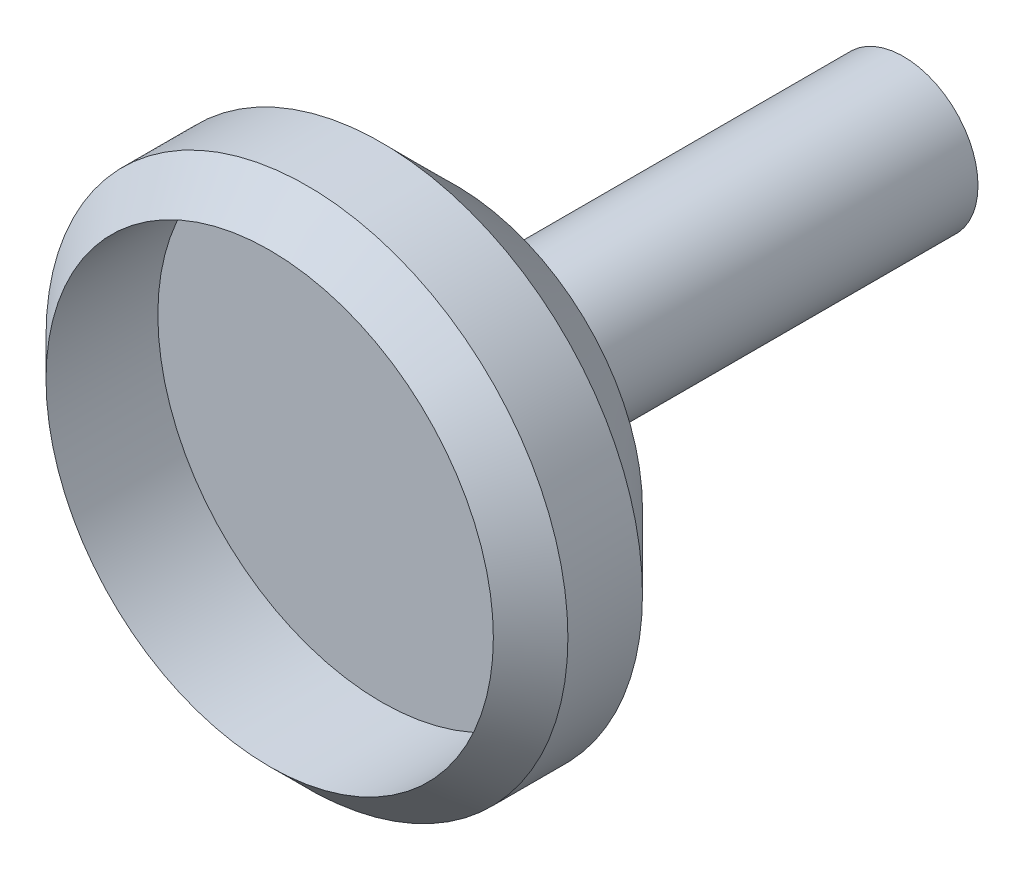
ISO-10303-21;
HEADER;
FILE_DESCRIPTION(('STEP AP214'),'2;1');
FILE_NAME('part.step','',(''),(''),'','','');
FILE_SCHEMA(('AUTOMOTIVE_DESIGN { 1 0 10303 214 1 1 1 1 }'));
ENDSEC;
DATA;
#1=APPLICATION_CONTEXT('core data for automotive mechanical design processes');
#2=APPLICATION_PROTOCOL_DEFINITION('international standard','automotive_design',2000,#1);
#3=PRODUCT_CONTEXT('',#1,'mechanical');
#4=PRODUCT('Part','Part','',(#3));
#5=PRODUCT_RELATED_PRODUCT_CATEGORY('part','',(#4));
#6=PRODUCT_DEFINITION_FORMATION('','',#4);
#7=PRODUCT_DEFINITION_CONTEXT('part definition',#1,'design');
#8=PRODUCT_DEFINITION('design','',#6,#7);
#9=PRODUCT_DEFINITION_SHAPE('','',#8);
#10=(LENGTH_UNIT() NAMED_UNIT(*) SI_UNIT(.MILLI.,.METRE.));
#11=(NAMED_UNIT(*) PLANE_ANGLE_UNIT() SI_UNIT($,.RADIAN.));
#12=(NAMED_UNIT(*) SI_UNIT($,.STERADIAN.) SOLID_ANGLE_UNIT());
#13=UNCERTAINTY_MEASURE_WITH_UNIT(LENGTH_MEASURE(1.E-05),#10,'distance_accuracy_value','');
#14=(GEOMETRIC_REPRESENTATION_CONTEXT(3) GLOBAL_UNCERTAINTY_ASSIGNED_CONTEXT((#13)) GLOBAL_UNIT_ASSIGNED_CONTEXT((#10,
#11,#12)) REPRESENTATION_CONTEXT('',''));
#15=CARTESIAN_POINT('',(0.,0.,0.));
#16=DIRECTION('',(0.,0.,1.));
#17=DIRECTION('',(1.,0.,0.));
#18=AXIS2_PLACEMENT_3D('',#15,#16,#17);
#19=CARTESIAN_POINT('',(0.,0.,0.));
#20=DIRECTION('',(0.,0.,1.));
#21=DIRECTION('',(1.,0.,0.));
#22=AXIS2_PLACEMENT_3D('',#19,#20,#21);
#23=PLANE('',#22);
#24=CARTESIAN_POINT('',(0.,0.,0.));
#25=DIRECTION('',(0.,0.,1.));
#26=DIRECTION('',(1.,0.,0.));
#27=AXIS2_PLACEMENT_3D('',#24,#25,#26);
#28=CIRCLE('',#27,1.);
#29=CARTESIAN_POINT('',(1.,0.,0.));
#30=VERTEX_POINT('',#29);
#31=EDGE_CURVE('E51',#30,#30,#28,.T.);
#32=ORIENTED_EDGE('',*,*,#31,.F.);
#33=EDGE_LOOP('',(#32));
#34=FACE_BOUND('',#33,.T.);
#35=CARTESIAN_POINT('',(0.,0.,0.));
#36=DIRECTION('',(0.,0.,1.));
#37=DIRECTION('',(1.,0.,0.));
#38=AXIS2_PLACEMENT_3D('',#35,#36,#37);
#39=CIRCLE('',#38,0.5);
#40=CARTESIAN_POINT('',(0.5,0.,0.));
#41=VERTEX_POINT('',#40);
#42=EDGE_CURVE('E54',#41,#41,#39,.T.);
#43=ORIENTED_EDGE('',*,*,#42,.T.);
#44=EDGE_LOOP('',(#43));
#45=FACE_BOUND('',#44,.T.);
#46=ADVANCED_FACE('F30',(#34,#45),#23,.F.);
#47=CARTESIAN_POINT('',(0.,0.,6.));
#48=DIRECTION('',(0.,0.,-1.));
#49=DIRECTION('',(-1.,0.,0.));
#50=AXIS2_PLACEMENT_3D('',#47,#48,#49);
#51=CYLINDRICAL_SURFACE('',#50,1.);
#52=CARTESIAN_POINT('',(0.,0.,6.));
#53=DIRECTION('',(0.,0.,1.));
#54=DIRECTION('',(1.,0.,0.));
#55=AXIS2_PLACEMENT_3D('',#52,#53,#54);
#56=CIRCLE('',#55,1.);
#57=CARTESIAN_POINT('',(1.,0.,6.));
#58=VERTEX_POINT('',#57);
#59=EDGE_CURVE('E50',#58,#58,#56,.T.);
#60=ORIENTED_EDGE('',*,*,#59,.F.);
#61=EDGE_LOOP('',(#60));
#62=FACE_BOUND('',#61,.T.);
#63=ORIENTED_EDGE('',*,*,#31,.T.);
#64=EDGE_LOOP('',(#63));
#65=FACE_BOUND('',#64,.T.);
#66=ADVANCED_FACE('F83',(#62,#65),#51,.T.);
#67=CARTESIAN_POINT('',(0.,0.,6.));
#68=DIRECTION('',(0.,0.,-1.));
#69=DIRECTION('',(-1.,0.,0.));
#70=AXIS2_PLACEMENT_3D('',#67,#68,#69);
#71=CYLINDRICAL_SURFACE('',#70,0.5);
#72=CARTESIAN_POINT('',(0.,0.,6.));
#73=DIRECTION('',(0.,0.,1.));
#74=DIRECTION('',(1.,0.,0.));
#75=AXIS2_PLACEMENT_3D('',#72,#73,#74);
#76=CIRCLE('',#75,0.5);
#77=CARTESIAN_POINT('',(0.5,0.,6.));
#78=VERTEX_POINT('',#77);
#79=EDGE_CURVE('E59',#78,#78,#76,.T.);
#80=ORIENTED_EDGE('',*,*,#79,.T.);
#81=EDGE_LOOP('',(#80));
#82=FACE_BOUND('',#81,.T.);
#83=ORIENTED_EDGE('',*,*,#42,.F.);
#84=EDGE_LOOP('',(#83));
#85=FACE_BOUND('',#84,.T.);
#86=ADVANCED_FACE('F89',(#82,#85),#71,.F.);
#87=CARTESIAN_POINT('',(0.,0.,6.));
#88=DIRECTION('',(0.,0.,1.));
#89=DIRECTION('',(1.,0.,0.));
#90=AXIS2_PLACEMENT_3D('',#87,#88,#89);
#91=PLANE('',#90);
#92=ORIENTED_EDGE('',*,*,#79,.F.);
#93=EDGE_LOOP('',(#92));
#94=FACE_BOUND('',#93,.T.);
#95=ADVANCED_FACE('F81',(#94),#91,.F.);
#96=CARTESIAN_POINT('',(0.,0.,9.));
#97=DIRECTION('',(0.,0.,-1.));
#98=DIRECTION('',(-1.,0.,0.));
#99=AXIS2_PLACEMENT_3D('',#96,#97,#98);
#100=CYLINDRICAL_SURFACE('',#99,3.5);
#101=CARTESIAN_POINT('',(0.,0.,7.99999999999999));
#102=DIRECTION('',(0.,0.,1.));
#103=DIRECTION('',(1.,0.,0.));
#104=AXIS2_PLACEMENT_3D('',#101,#102,#103);
#105=CIRCLE('',#104,3.5);
#106=CARTESIAN_POINT('',(3.5,0.,7.99999999999999));
#107=VERTEX_POINT('',#106);
#108=EDGE_CURVE('E37',#107,#107,#105,.F.);
#109=ORIENTED_EDGE('',*,*,#108,.T.);
#110=EDGE_LOOP('',(#109));
#111=FACE_BOUND('',#110,.T.);
#112=CARTESIAN_POINT('',(0.,0.,7.));
#113=DIRECTION('',(0.,0.,1.));
#114=DIRECTION('',(1.,0.,0.));
#115=AXIS2_PLACEMENT_3D('',#112,#113,#114);
#116=CIRCLE('',#115,3.5);
#117=CARTESIAN_POINT('',(3.5,0.,7.));
#118=VERTEX_POINT('',#117);
#119=EDGE_CURVE('E41',#118,#118,#116,.T.);
#120=ORIENTED_EDGE('',*,*,#119,.T.);
#121=EDGE_LOOP('',(#120));
#122=FACE_BOUND('',#121,.T.);
#123=ADVANCED_FACE('F79',(#111,#122),#100,.T.);
#124=CARTESIAN_POINT('',(0.,0.,6.));
#125=DIRECTION('',(0.,0.,1.));
#126=DIRECTION('',(1.,0.,0.));
#127=AXIS2_PLACEMENT_3D('',#124,#125,#126);
#128=CIRCLE('',#127,2.5);
#129=CARTESIAN_POINT('',(2.5,0.,6.));
#130=VERTEX_POINT('',#129);
#131=EDGE_CURVE('E10',#130,#130,#128,.F.);
#132=ORIENTED_EDGE('',*,*,#131,.T.);
#133=EDGE_LOOP('',(#132));
#134=FACE_BOUND('',#133,.T.);
#135=ORIENTED_EDGE('',*,*,#59,.T.);
#136=EDGE_LOOP('',(#135));
#137=FACE_BOUND('',#136,.T.);
#138=ADVANCED_FACE('F70',(#134,#137),#91,.F.);
#139=CARTESIAN_POINT('',(0.,0.,7.));
#140=DIRECTION('',(0.,0.,1.));
#141=DIRECTION('',(1.,0.,0.));
#142=AXIS2_PLACEMENT_3D('',#139,#140,#141);
#143=CYLINDRICAL_SURFACE('',#142,3.);
#144=CARTESIAN_POINT('',(0.,0.,8.49999999999999));
#145=DIRECTION('',(0.,0.,-1.));
#146=DIRECTION('',(-1.,0.,0.));
#147=AXIS2_PLACEMENT_3D('',#144,#145,#146);
#148=CIRCLE('',#147,3.);
#149=CARTESIAN_POINT('',(-3.,0.,8.49999999999999));
#150=VERTEX_POINT('',#149);
#151=EDGE_CURVE('E45',#150,#150,#148,.F.);
#152=ORIENTED_EDGE('',*,*,#151,.T.);
#153=EDGE_LOOP('',(#152));
#154=FACE_BOUND('',#153,.T.);
#155=CARTESIAN_POINT('',(0.,0.,7.));
#156=DIRECTION('',(0.,0.,1.));
#157=DIRECTION('',(1.,0.,0.));
#158=AXIS2_PLACEMENT_3D('',#155,#156,#157);
#159=CIRCLE('',#158,3.);
#160=CARTESIAN_POINT('',(3.,0.,7.));
#161=VERTEX_POINT('',#160);
#162=EDGE_CURVE('E62',#161,#161,#159,.T.);
#163=ORIENTED_EDGE('',*,*,#162,.F.);
#164=EDGE_LOOP('',(#163));
#165=FACE_BOUND('',#164,.T.);
#166=ADVANCED_FACE('F68',(#154,#165),#143,.F.);
#167=CARTESIAN_POINT('',(0.,0.,7.));
#168=DIRECTION('',(0.,0.,1.));
#169=DIRECTION('',(1.,0.,0.));
#170=AXIS2_PLACEMENT_3D('',#167,#168,#169);
#171=PLANE('',#170);
#172=ORIENTED_EDGE('',*,*,#162,.T.);
#173=EDGE_LOOP('',(#172));
#174=FACE_BOUND('',#173,.T.);
#175=ADVANCED_FACE('F66',(#174),#171,.T.);
#176=CARTESIAN_POINT('',(0.,0.,9.));
#177=DIRECTION('',(0.,0.,-1.));
#178=DIRECTION('',(-1.,0.,0.));
#179=AXIS2_PLACEMENT_3D('',#176,#177,#178);
#180=CONICAL_SURFACE('',#179,2.49999999999998,0.785398163397453);
#181=ORIENTED_EDGE('',*,*,#108,.F.);
#182=EDGE_LOOP('',(#181));
#183=FACE_BOUND('',#182,.T.);
#184=ORIENTED_EDGE('',*,*,#151,.F.);
#185=EDGE_LOOP('',(#184));
#186=FACE_BOUND('',#185,.T.);
#187=ADVANCED_FACE('F77',(#183,#186),#180,.T.);
#188=CARTESIAN_POINT('',(0.,0.,7.));
#189=DIRECTION('',(0.,0.,1.));
#190=DIRECTION('',(1.,0.,0.));
#191=AXIS2_PLACEMENT_3D('',#188,#189,#190);
#192=CONICAL_SURFACE('',#191,3.5,0.78539816339745);
#193=ORIENTED_EDGE('',*,*,#131,.F.);
#194=EDGE_LOOP('',(#193));
#195=FACE_BOUND('',#194,.T.);
#196=ORIENTED_EDGE('',*,*,#119,.F.);
#197=EDGE_LOOP('',(#196));
#198=FACE_BOUND('',#197,.T.);
#199=ADVANCED_FACE('F32',(#195,#198),#192,.T.);
#200=CLOSED_SHELL('',(#46,#66,#86,#95,#123,#138,#166,#175,#187,#199));
#201=MANIFOLD_SOLID_BREP('B2',#200);
#202=ADVANCED_BREP_SHAPE_REPRESENTATION('',(#18,#201),#14);
#203=SHAPE_DEFINITION_REPRESENTATION(#9,#202);
ENDSEC;
END-ISO-10303-21;
